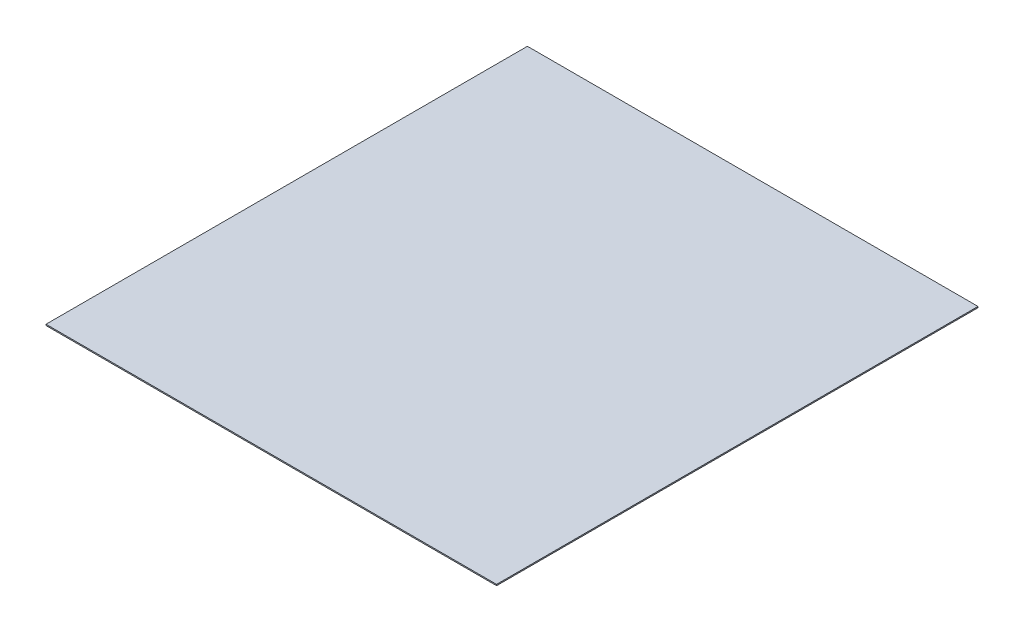
ISO-10303-21;
HEADER;
FILE_DESCRIPTION(('STEP AP214'),'2;1');
FILE_NAME('part.step','',(''),(''),'','','');
FILE_SCHEMA(('AUTOMOTIVE_DESIGN { 1 0 10303 214 1 1 1 1 }'));
ENDSEC;
DATA;
#1=APPLICATION_CONTEXT('core data for automotive mechanical design processes');
#2=APPLICATION_PROTOCOL_DEFINITION('international standard','automotive_design',2000,#1);
#3=PRODUCT_CONTEXT('',#1,'mechanical');
#4=PRODUCT('Part','Part','',(#3));
#5=PRODUCT_RELATED_PRODUCT_CATEGORY('part','',(#4));
#6=PRODUCT_DEFINITION_FORMATION('','',#4);
#7=PRODUCT_DEFINITION_CONTEXT('part definition',#1,'design');
#8=PRODUCT_DEFINITION('design','',#6,#7);
#9=PRODUCT_DEFINITION_SHAPE('','',#8);
#10=(LENGTH_UNIT() NAMED_UNIT(*) SI_UNIT(.MILLI.,.METRE.));
#11=(NAMED_UNIT(*) PLANE_ANGLE_UNIT() SI_UNIT($,.RADIAN.));
#12=(NAMED_UNIT(*) SI_UNIT($,.STERADIAN.) SOLID_ANGLE_UNIT());
#13=UNCERTAINTY_MEASURE_WITH_UNIT(LENGTH_MEASURE(1.E-05),#10,'distance_accuracy_value','');
#14=(GEOMETRIC_REPRESENTATION_CONTEXT(3) GLOBAL_UNCERTAINTY_ASSIGNED_CONTEXT((#13)) GLOBAL_UNIT_ASSIGNED_CONTEXT((#10,
#11,#12)) REPRESENTATION_CONTEXT('',''));
#15=CARTESIAN_POINT('',(0.,0.,0.));
#16=DIRECTION('',(0.,0.,1.));
#17=DIRECTION('',(1.,0.,0.));
#18=AXIS2_PLACEMENT_3D('',#15,#16,#17);
#19=CARTESIAN_POINT('',(95.,0.5,-101.5));
#20=DIRECTION('',(-1.,0.,0.));
#21=DIRECTION('',(0.,0.,1.));
#22=AXIS2_PLACEMENT_3D('',#19,#20,#21);
#23=PLANE('',#22);
#24=DIRECTION('',(0.,0.,-1.));
#25=VECTOR('',#24,1.);
#26=CARTESIAN_POINT('',(95.,0.,-101.5));
#27=LINE('',#26,#25);
#28=CARTESIAN_POINT('',(95.,0.,101.5));
#29=VERTEX_POINT('',#28);
#30=CARTESIAN_POINT('',(95.,0.,-101.5));
#31=VERTEX_POINT('',#30);
#32=EDGE_CURVE('E106',#29,#31,#27,.T.);
#33=ORIENTED_EDGE('',*,*,#32,.T.);
#34=DIRECTION('',(0.,-1.,0.));
#35=VECTOR('',#34,1.);
#36=CARTESIAN_POINT('',(95.,0.5,-101.5));
#37=LINE('',#36,#35);
#38=CARTESIAN_POINT('',(95.,0.5,-101.5));
#39=VERTEX_POINT('',#38);
#40=EDGE_CURVE('E11',#39,#31,#37,.T.);
#41=ORIENTED_EDGE('',*,*,#40,.F.);
#42=DIRECTION('',(0.,0.,-1.));
#43=VECTOR('',#42,1.);
#44=CARTESIAN_POINT('',(95.,0.5,-101.5));
#45=LINE('',#44,#43);
#46=CARTESIAN_POINT('',(95.,0.5,101.5));
#47=VERTEX_POINT('',#46);
#48=EDGE_CURVE('E90',#47,#39,#45,.T.);
#49=ORIENTED_EDGE('',*,*,#48,.F.);
#50=DIRECTION('',(0.,-1.,0.));
#51=VECTOR('',#50,1.);
#52=CARTESIAN_POINT('',(95.,0.5,101.5));
#53=LINE('',#52,#51);
#54=EDGE_CURVE('E102',#47,#29,#53,.T.);
#55=ORIENTED_EDGE('',*,*,#54,.T.);
#56=EDGE_LOOP('',(#33,#41,#49,#55));
#57=FACE_BOUND('',#56,.T.);
#58=ADVANCED_FACE('F38',(#57),#23,.F.);
#59=CARTESIAN_POINT('',(-95.,0.5,-101.5));
#60=DIRECTION('',(0.,0.,1.));
#61=DIRECTION('',(1.,0.,0.));
#62=AXIS2_PLACEMENT_3D('',#59,#60,#61);
#63=PLANE('',#62);
#64=DIRECTION('',(-1.,0.,0.));
#65=VECTOR('',#64,1.);
#66=CARTESIAN_POINT('',(-95.,0.,-101.5));
#67=LINE('',#66,#65);
#68=CARTESIAN_POINT('',(-95.,0.,-101.5));
#69=VERTEX_POINT('',#68);
#70=EDGE_CURVE('E95',#31,#69,#67,.T.);
#71=ORIENTED_EDGE('',*,*,#70,.T.);
#72=DIRECTION('',(0.,-1.,0.));
#73=VECTOR('',#72,1.);
#74=CARTESIAN_POINT('',(-95.,0.5,-101.5));
#75=LINE('',#74,#73);
#76=CARTESIAN_POINT('',(-95.,0.5,-101.5));
#77=VERTEX_POINT('',#76);
#78=EDGE_CURVE('E47',#77,#69,#75,.T.);
#79=ORIENTED_EDGE('',*,*,#78,.F.);
#80=DIRECTION('',(-1.,0.,0.));
#81=VECTOR('',#80,1.);
#82=CARTESIAN_POINT('',(-95.,0.5,-101.5));
#83=LINE('',#82,#81);
#84=EDGE_CURVE('E85',#39,#77,#83,.T.);
#85=ORIENTED_EDGE('',*,*,#84,.F.);
#86=ORIENTED_EDGE('',*,*,#40,.T.);
#87=EDGE_LOOP('',(#71,#79,#85,#86));
#88=FACE_BOUND('',#87,.T.);
#89=ADVANCED_FACE('F94',(#88),#63,.F.);
#90=CARTESIAN_POINT('',(-95.,0.5,-101.5));
#91=DIRECTION('',(1.,0.,0.));
#92=DIRECTION('',(0.,0.,-1.));
#93=AXIS2_PLACEMENT_3D('',#90,#91,#92);
#94=PLANE('',#93);
#95=DIRECTION('',(0.,0.,1.));
#96=VECTOR('',#95,1.);
#97=CARTESIAN_POINT('',(-95.,0.,-101.5));
#98=LINE('',#97,#96);
#99=CARTESIAN_POINT('',(-95.,0.,101.5));
#100=VERTEX_POINT('',#99);
#101=EDGE_CURVE('E72',#69,#100,#98,.T.);
#102=ORIENTED_EDGE('',*,*,#101,.T.);
#103=DIRECTION('',(0.,-1.,0.));
#104=VECTOR('',#103,1.);
#105=CARTESIAN_POINT('',(-95.,0.5,101.5));
#106=LINE('',#105,#104);
#107=CARTESIAN_POINT('',(-95.,0.5,101.5));
#108=VERTEX_POINT('',#107);
#109=EDGE_CURVE('E97',#108,#100,#106,.T.);
#110=ORIENTED_EDGE('',*,*,#109,.F.);
#111=DIRECTION('',(0.,0.,1.));
#112=VECTOR('',#111,1.);
#113=CARTESIAN_POINT('',(-95.,0.5,-101.5));
#114=LINE('',#113,#112);
#115=EDGE_CURVE('E88',#77,#108,#114,.T.);
#116=ORIENTED_EDGE('',*,*,#115,.F.);
#117=ORIENTED_EDGE('',*,*,#78,.T.);
#118=EDGE_LOOP('',(#102,#110,#116,#117));
#119=FACE_BOUND('',#118,.T.);
#120=ADVANCED_FACE('F98',(#119),#94,.F.);
#121=CARTESIAN_POINT('',(-95.,0.5,101.5));
#122=DIRECTION('',(0.,0.,-1.));
#123=DIRECTION('',(-1.,0.,0.));
#124=AXIS2_PLACEMENT_3D('',#121,#122,#123);
#125=PLANE('',#124);
#126=DIRECTION('',(1.,0.,0.));
#127=VECTOR('',#126,1.);
#128=CARTESIAN_POINT('',(-95.,0.,101.5));
#129=LINE('',#128,#127);
#130=EDGE_CURVE('E78',#100,#29,#129,.T.);
#131=ORIENTED_EDGE('',*,*,#130,.T.);
#132=ORIENTED_EDGE('',*,*,#54,.F.);
#133=DIRECTION('',(1.,0.,0.));
#134=VECTOR('',#133,1.);
#135=CARTESIAN_POINT('',(-95.,0.5,101.5));
#136=LINE('',#135,#134);
#137=EDGE_CURVE('E55',#108,#47,#136,.T.);
#138=ORIENTED_EDGE('',*,*,#137,.F.);
#139=ORIENTED_EDGE('',*,*,#109,.T.);
#140=EDGE_LOOP('',(#131,#132,#138,#139));
#141=FACE_BOUND('',#140,.T.);
#142=ADVANCED_FACE('F119',(#141),#125,.F.);
#143=CARTESIAN_POINT('',(0.,0.5,0.));
#144=DIRECTION('',(0.,1.,0.));
#145=DIRECTION('',(0.,0.,1.));
#146=AXIS2_PLACEMENT_3D('',#143,#144,#145);
#147=PLANE('',#146);
#148=ORIENTED_EDGE('',*,*,#48,.T.);
#149=ORIENTED_EDGE('',*,*,#84,.T.);
#150=ORIENTED_EDGE('',*,*,#115,.T.);
#151=ORIENTED_EDGE('',*,*,#137,.T.);
#152=EDGE_LOOP('',(#148,#149,#150,#151));
#153=FACE_BOUND('',#152,.T.);
#154=ADVANCED_FACE('F86',(#153),#147,.T.);
#155=CARTESIAN_POINT('',(0.,0.,0.));
#156=DIRECTION('',(0.,1.,0.));
#157=DIRECTION('',(0.,0.,1.));
#158=AXIS2_PLACEMENT_3D('',#155,#156,#157);
#159=PLANE('',#158);
#160=ORIENTED_EDGE('',*,*,#32,.F.);
#161=ORIENTED_EDGE('',*,*,#130,.F.);
#162=ORIENTED_EDGE('',*,*,#101,.F.);
#163=ORIENTED_EDGE('',*,*,#70,.F.);
#164=EDGE_LOOP('',(#160,#161,#162,#163));
#165=FACE_BOUND('',#164,.T.);
#166=ADVANCED_FACE('F122',(#165),#159,.F.);
#167=CLOSED_SHELL('',(#58,#89,#120,#142,#154,#166));
#168=MANIFOLD_SOLID_BREP('B2',#167);
#169=ADVANCED_BREP_SHAPE_REPRESENTATION('',(#18,#168),#14);
#170=SHAPE_DEFINITION_REPRESENTATION(#9,#169);
ENDSEC;
END-ISO-10303-21;
